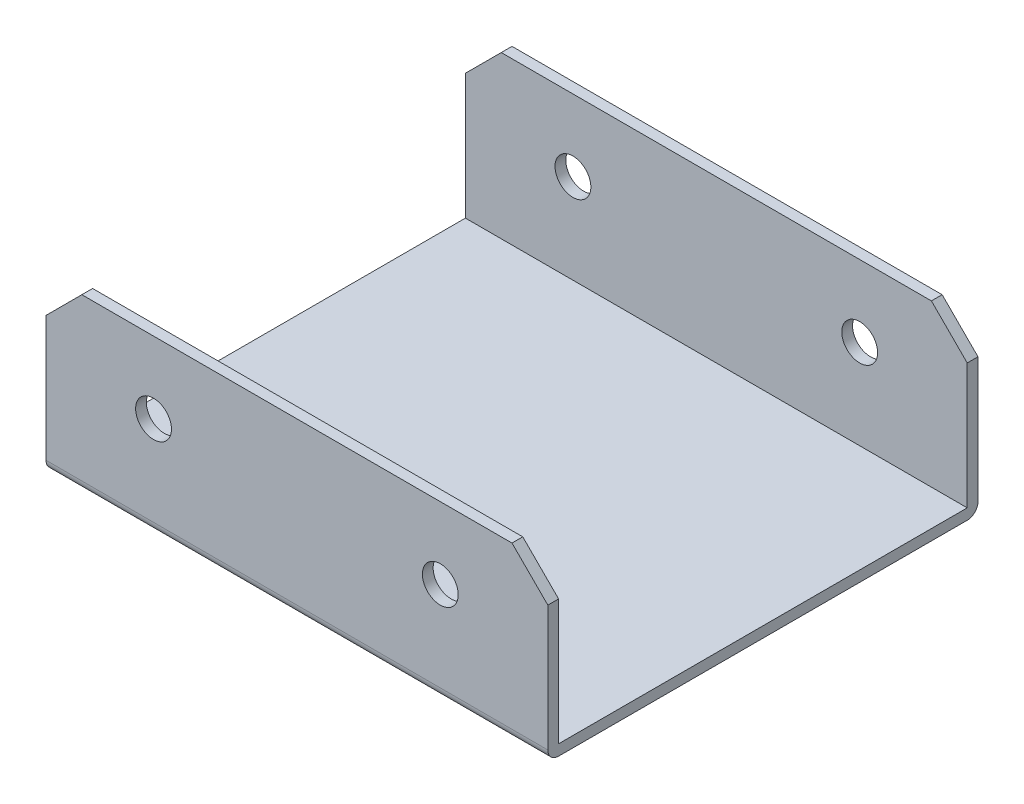
ISO-10303-21;
HEADER;
FILE_DESCRIPTION(('STEP AP214'),'2;1');
FILE_NAME('part.step','',(''),(''),'','','');
FILE_SCHEMA(('AUTOMOTIVE_DESIGN { 1 0 10303 214 1 1 1 1 }'));
ENDSEC;
DATA;
#1=APPLICATION_CONTEXT('core data for automotive mechanical design processes');
#2=APPLICATION_PROTOCOL_DEFINITION('international standard','automotive_design',2000,#1);
#3=PRODUCT_CONTEXT('',#1,'mechanical');
#4=PRODUCT('Part','Part','',(#3));
#5=PRODUCT_RELATED_PRODUCT_CATEGORY('part','',(#4));
#6=PRODUCT_DEFINITION_FORMATION('','',#4);
#7=PRODUCT_DEFINITION_CONTEXT('part definition',#1,'design');
#8=PRODUCT_DEFINITION('design','',#6,#7);
#9=PRODUCT_DEFINITION_SHAPE('','',#8);
#10=(LENGTH_UNIT() NAMED_UNIT(*) SI_UNIT(.MILLI.,.METRE.));
#11=(NAMED_UNIT(*) PLANE_ANGLE_UNIT() SI_UNIT($,.RADIAN.));
#12=(NAMED_UNIT(*) SI_UNIT($,.STERADIAN.) SOLID_ANGLE_UNIT());
#13=UNCERTAINTY_MEASURE_WITH_UNIT(LENGTH_MEASURE(1.E-05),#10,'distance_accuracy_value','');
#14=(GEOMETRIC_REPRESENTATION_CONTEXT(3) GLOBAL_UNCERTAINTY_ASSIGNED_CONTEXT((#13)) GLOBAL_UNIT_ASSIGNED_CONTEXT((#10,
#11,#12)) REPRESENTATION_CONTEXT('',''));
#15=CARTESIAN_POINT('',(0.,0.,0.));
#16=DIRECTION('',(0.,0.,1.));
#17=DIRECTION('',(1.,0.,0.));
#18=AXIS2_PLACEMENT_3D('',#15,#16,#17);
#19=CARTESIAN_POINT('',(-20.,14.,30.));
#20=DIRECTION('',(0.,0.,-1.));
#21=DIRECTION('',(0.,-1.,0.));
#22=AXIS2_PLACEMENT_3D('',#19,#20,#21);
#23=CYLINDRICAL_SURFACE('',#22,2.5);
#24=CARTESIAN_POINT('',(-20.,14.,30.));
#25=DIRECTION('',(0.,0.,-1.));
#26=DIRECTION('',(0.,-1.,0.));
#27=AXIS2_PLACEMENT_3D('',#24,#25,#26);
#28=CIRCLE('',#27,2.5);
#29=CARTESIAN_POINT('',(-20.,11.5,30.));
#30=VERTEX_POINT('',#29);
#31=EDGE_CURVE('E155',#30,#30,#28,.T.);
#32=ORIENTED_EDGE('',*,*,#31,.F.);
#33=EDGE_LOOP('',(#32));
#34=FACE_BOUND('',#33,.T.);
#35=CARTESIAN_POINT('',(-20.,14.,28.5));
#36=DIRECTION('',(0.,0.,1.));
#37=DIRECTION('',(1.,0.,0.));
#38=AXIS2_PLACEMENT_3D('',#35,#36,#37);
#39=CIRCLE('',#38,2.5);
#40=CARTESIAN_POINT('',(-17.5,14.,28.5));
#41=VERTEX_POINT('',#40);
#42=EDGE_CURVE('E165',#41,#41,#39,.T.);
#43=ORIENTED_EDGE('',*,*,#42,.F.);
#44=EDGE_LOOP('',(#43));
#45=FACE_BOUND('',#44,.T.);
#46=ADVANCED_FACE('F16',(#34,#45),#23,.F.);
#47=CARTESIAN_POINT('',(-20.,14.,30.));
#48=DIRECTION('',(0.,0.,-1.));
#49=DIRECTION('',(0.,-1.,0.));
#50=AXIS2_PLACEMENT_3D('',#47,#48,#49);
#51=CYLINDRICAL_SURFACE('',#50,2.5);
#52=CARTESIAN_POINT('',(-20.,14.,-28.5));
#53=DIRECTION('',(0.,0.,-1.));
#54=DIRECTION('',(0.,-1.,0.));
#55=AXIS2_PLACEMENT_3D('',#52,#53,#54);
#56=CIRCLE('',#55,2.5);
#57=CARTESIAN_POINT('',(-20.,11.5,-28.5));
#58=VERTEX_POINT('',#57);
#59=EDGE_CURVE('E192',#58,#58,#56,.T.);
#60=ORIENTED_EDGE('',*,*,#59,.F.);
#61=EDGE_LOOP('',(#60));
#62=FACE_BOUND('',#61,.T.);
#63=CARTESIAN_POINT('',(-20.,14.,-30.));
#64=DIRECTION('',(0.,0.,1.));
#65=DIRECTION('',(1.,0.,0.));
#66=AXIS2_PLACEMENT_3D('',#63,#64,#65);
#67=CIRCLE('',#66,2.5);
#68=CARTESIAN_POINT('',(-17.5,14.,-30.));
#69=VERTEX_POINT('',#68);
#70=EDGE_CURVE('E214',#69,#69,#67,.T.);
#71=ORIENTED_EDGE('',*,*,#70,.F.);
#72=EDGE_LOOP('',(#71));
#73=FACE_BOUND('',#72,.T.);
#74=ADVANCED_FACE('F269',(#62,#73),#51,.F.);
#75=CARTESIAN_POINT('',(20.,14.,30.));
#76=DIRECTION('',(0.,0.,-1.));
#77=DIRECTION('',(0.,-1.,0.));
#78=AXIS2_PLACEMENT_3D('',#75,#76,#77);
#79=CYLINDRICAL_SURFACE('',#78,2.5);
#80=CARTESIAN_POINT('',(20.,14.,30.));
#81=DIRECTION('',(0.,0.,-1.));
#82=DIRECTION('',(0.,-1.,0.));
#83=AXIS2_PLACEMENT_3D('',#80,#81,#82);
#84=CIRCLE('',#83,2.5);
#85=CARTESIAN_POINT('',(20.,11.5,30.));
#86=VERTEX_POINT('',#85);
#87=EDGE_CURVE('E180',#86,#86,#84,.T.);
#88=ORIENTED_EDGE('',*,*,#87,.F.);
#89=EDGE_LOOP('',(#88));
#90=FACE_BOUND('',#89,.T.);
#91=CARTESIAN_POINT('',(20.,14.,28.5));
#92=DIRECTION('',(0.,0.,1.));
#93=DIRECTION('',(1.,0.,0.));
#94=AXIS2_PLACEMENT_3D('',#91,#92,#93);
#95=CIRCLE('',#94,2.5);
#96=CARTESIAN_POINT('',(22.5,14.,28.5));
#97=VERTEX_POINT('',#96);
#98=EDGE_CURVE('E162',#97,#97,#95,.T.);
#99=ORIENTED_EDGE('',*,*,#98,.F.);
#100=EDGE_LOOP('',(#99));
#101=FACE_BOUND('',#100,.T.);
#102=ADVANCED_FACE('F275',(#90,#101),#79,.F.);
#103=CARTESIAN_POINT('',(20.,14.,30.));
#104=DIRECTION('',(0.,0.,-1.));
#105=DIRECTION('',(0.,-1.,0.));
#106=AXIS2_PLACEMENT_3D('',#103,#104,#105);
#107=CYLINDRICAL_SURFACE('',#106,2.5);
#108=CARTESIAN_POINT('',(20.,14.,-28.5));
#109=DIRECTION('',(0.,0.,-1.));
#110=DIRECTION('',(0.,-1.,0.));
#111=AXIS2_PLACEMENT_3D('',#108,#109,#110);
#112=CIRCLE('',#111,2.5);
#113=CARTESIAN_POINT('',(20.,11.5,-28.5));
#114=VERTEX_POINT('',#113);
#115=EDGE_CURVE('E204',#114,#114,#112,.T.);
#116=ORIENTED_EDGE('',*,*,#115,.F.);
#117=EDGE_LOOP('',(#116));
#118=FACE_BOUND('',#117,.T.);
#119=CARTESIAN_POINT('',(20.,14.,-30.));
#120=DIRECTION('',(0.,0.,1.));
#121=DIRECTION('',(1.,0.,0.));
#122=AXIS2_PLACEMENT_3D('',#119,#120,#121);
#123=CIRCLE('',#122,2.5);
#124=CARTESIAN_POINT('',(22.5,14.,-30.));
#125=VERTEX_POINT('',#124);
#126=EDGE_CURVE('E199',#125,#125,#123,.T.);
#127=ORIENTED_EDGE('',*,*,#126,.F.);
#128=EDGE_LOOP('',(#127));
#129=FACE_BOUND('',#128,.T.);
#130=ADVANCED_FACE('F266',(#118,#129),#107,.F.);
#131=CARTESIAN_POINT('',(-32.5,21.5,28.875));
#132=DIRECTION('',(-0.707106781186548,0.707106781186548,0.));
#133=DIRECTION('',(-0.707106781186548,-0.707106781186548,0.));
#134=AXIS2_PLACEMENT_3D('',#131,#132,#133);
#135=PLANE('',#134);
#136=DIRECTION('',(0.707106781186548,0.707106781186548,0.));
#137=VECTOR('',#136,1.);
#138=CARTESIAN_POINT('',(-23.75,30.25,30.));
#139=LINE('',#138,#137);
#140=CARTESIAN_POINT('',(-35.,19.,30.));
#141=VERTEX_POINT('',#140);
#142=CARTESIAN_POINT('',(-30.,24.,30.));
#143=VERTEX_POINT('',#142);
#144=EDGE_CURVE('E10',#141,#143,#139,.T.);
#145=ORIENTED_EDGE('',*,*,#144,.T.);
#146=DIRECTION('',(0.,0.,-1.));
#147=VECTOR('',#146,1.);
#148=CARTESIAN_POINT('',(-30.,24.,28.875));
#149=LINE('',#148,#147);
#150=CARTESIAN_POINT('',(-30.,24.,28.5));
#151=VERTEX_POINT('',#150);
#152=EDGE_CURVE('E26',#143,#151,#149,.T.);
#153=ORIENTED_EDGE('',*,*,#152,.T.);
#154=DIRECTION('',(-0.707106781186548,-0.707106781186548,0.));
#155=VECTOR('',#154,1.);
#156=CARTESIAN_POINT('',(-29.375,24.625,28.5));
#157=LINE('',#156,#155);
#158=CARTESIAN_POINT('',(-35.,19.,28.5));
#159=VERTEX_POINT('',#158);
#160=EDGE_CURVE('E147',#151,#159,#157,.T.);
#161=ORIENTED_EDGE('',*,*,#160,.T.);
#162=DIRECTION('',(0.,0.,1.));
#163=VECTOR('',#162,1.);
#164=CARTESIAN_POINT('',(-35.,19.,28.875));
#165=LINE('',#164,#163);
#166=EDGE_CURVE('E142',#159,#141,#165,.T.);
#167=ORIENTED_EDGE('',*,*,#166,.T.);
#168=EDGE_LOOP('',(#145,#153,#161,#167));
#169=FACE_BOUND('',#168,.T.);
#170=ADVANCED_FACE('F150',(#169),#135,.T.);
#171=CARTESIAN_POINT('',(0.,24.,28.5));
#172=DIRECTION('',(0.,1.,0.));
#173=DIRECTION('',(0.,0.,1.));
#174=AXIS2_PLACEMENT_3D('',#171,#172,#173);
#175=PLANE('',#174);
#176=ORIENTED_EDGE('',*,*,#152,.F.);
#177=DIRECTION('',(1.,0.,0.));
#178=VECTOR('',#177,1.);
#179=CARTESIAN_POINT('',(0.,24.,30.));
#180=LINE('',#179,#178);
#181=CARTESIAN_POINT('',(30.,24.,30.));
#182=VERTEX_POINT('',#181);
#183=EDGE_CURVE('E148',#143,#182,#180,.T.);
#184=ORIENTED_EDGE('',*,*,#183,.T.);
#185=DIRECTION('',(0.,0.,1.));
#186=VECTOR('',#185,1.);
#187=CARTESIAN_POINT('',(30.,24.,28.875));
#188=LINE('',#187,#186);
#189=CARTESIAN_POINT('',(30.,24.,28.5));
#190=VERTEX_POINT('',#189);
#191=EDGE_CURVE('E156',#190,#182,#188,.T.);
#192=ORIENTED_EDGE('',*,*,#191,.F.);
#193=DIRECTION('',(1.,0.,0.));
#194=VECTOR('',#193,1.);
#195=CARTESIAN_POINT('',(0.,24.,28.5));
#196=LINE('',#195,#194);
#197=EDGE_CURVE('E160',#151,#190,#196,.T.);
#198=ORIENTED_EDGE('',*,*,#197,.F.);
#199=EDGE_LOOP('',(#176,#184,#192,#198));
#200=FACE_BOUND('',#199,.T.);
#201=ADVANCED_FACE('F255',(#200),#175,.T.);
#202=CARTESIAN_POINT('',(0.,24.,30.));
#203=DIRECTION('',(0.,0.,1.));
#204=DIRECTION('',(1.,0.,0.));
#205=AXIS2_PLACEMENT_3D('',#202,#203,#204);
#206=PLANE('',#205);
#207=ORIENTED_EDGE('',*,*,#31,.T.);
#208=EDGE_LOOP('',(#207));
#209=FACE_BOUND('',#208,.T.);
#210=ORIENTED_EDGE('',*,*,#87,.T.);
#211=EDGE_LOOP('',(#210));
#212=FACE_BOUND('',#211,.T.);
#213=ORIENTED_EDGE('',*,*,#144,.F.);
#214=DIRECTION('',(0.,1.,0.));
#215=VECTOR('',#214,1.);
#216=CARTESIAN_POINT('',(-35.,24.,30.));
#217=LINE('',#216,#215);
#218=CARTESIAN_POINT('',(-35.,1.49999999999998,30.));
#219=VERTEX_POINT('',#218);
#220=EDGE_CURVE('E144',#219,#141,#217,.T.);
#221=ORIENTED_EDGE('',*,*,#220,.F.);
#222=DIRECTION('',(-1.,0.,0.));
#223=VECTOR('',#222,1.);
#224=CARTESIAN_POINT('',(0.,1.49999999999998,30.));
#225=LINE('',#224,#223);
#226=CARTESIAN_POINT('',(35.,1.49999999999998,30.));
#227=VERTEX_POINT('',#226);
#228=EDGE_CURVE('E137',#227,#219,#225,.T.);
#229=ORIENTED_EDGE('',*,*,#228,.F.);
#230=DIRECTION('',(0.,-1.,0.));
#231=VECTOR('',#230,1.);
#232=CARTESIAN_POINT('',(35.,24.,30.));
#233=LINE('',#232,#231);
#234=CARTESIAN_POINT('',(35.,19.,30.));
#235=VERTEX_POINT('',#234);
#236=EDGE_CURVE('E169',#235,#227,#233,.T.);
#237=ORIENTED_EDGE('',*,*,#236,.F.);
#238=DIRECTION('',(0.707106781186548,-0.707106781186548,0.));
#239=VECTOR('',#238,1.);
#240=CARTESIAN_POINT('',(23.75,30.25,30.));
#241=LINE('',#240,#239);
#242=EDGE_CURVE('E173',#182,#235,#241,.T.);
#243=ORIENTED_EDGE('',*,*,#242,.F.);
#244=ORIENTED_EDGE('',*,*,#183,.F.);
#245=EDGE_LOOP('',(#213,#221,#229,#237,#243,#244));
#246=FACE_BOUND('',#245,.T.);
#247=ADVANCED_FACE('F245',(#209,#212,#246),#206,.T.);
#248=CARTESIAN_POINT('',(-32.5,21.5000000000001,-0.375000000000015));
#249=DIRECTION('',(-0.707106781186548,0.707106781186548,0.));
#250=DIRECTION('',(-0.707106781186548,-0.707106781186548,0.));
#251=AXIS2_PLACEMENT_3D('',#248,#249,#250);
#252=PLANE('',#251);
#253=DIRECTION('',(-0.707106781186548,-0.707106781186548,0.));
#254=VECTOR('',#253,1.);
#255=CARTESIAN_POINT('',(-29.375,24.625,-30.));
#256=LINE('',#255,#254);
#257=CARTESIAN_POINT('',(-30.,24.,-30.));
#258=VERTEX_POINT('',#257);
#259=CARTESIAN_POINT('',(-35.,19.,-30.));
#260=VERTEX_POINT('',#259);
#261=EDGE_CURVE('E177',#258,#260,#256,.T.);
#262=ORIENTED_EDGE('',*,*,#261,.T.);
#263=DIRECTION('',(0.,0.,1.));
#264=VECTOR('',#263,1.);
#265=CARTESIAN_POINT('',(-35.,19.0000000000001,-0.375000000000008));
#266=LINE('',#265,#264);
#267=CARTESIAN_POINT('',(-35.,19.,-28.5));
#268=VERTEX_POINT('',#267);
#269=EDGE_CURVE('E181',#260,#268,#266,.T.);
#270=ORIENTED_EDGE('',*,*,#269,.T.);
#271=DIRECTION('',(0.707106781186548,0.707106781186548,0.));
#272=VECTOR('',#271,1.);
#273=CARTESIAN_POINT('',(-23.75,30.25,-28.5));
#274=LINE('',#273,#272);
#275=CARTESIAN_POINT('',(-30.,24.,-28.5));
#276=VERTEX_POINT('',#275);
#277=EDGE_CURVE('E184',#268,#276,#274,.T.);
#278=ORIENTED_EDGE('',*,*,#277,.T.);
#279=DIRECTION('',(0.,0.,-1.));
#280=VECTOR('',#279,1.);
#281=CARTESIAN_POINT('',(-30.,24.0000000000001,-0.375000000000023));
#282=LINE('',#281,#280);
#283=EDGE_CURVE('E187',#276,#258,#282,.T.);
#284=ORIENTED_EDGE('',*,*,#283,.T.);
#285=EDGE_LOOP('',(#262,#270,#278,#284));
#286=FACE_BOUND('',#285,.T.);
#287=ADVANCED_FACE('F263',(#286),#252,.T.);
#288=CARTESIAN_POINT('',(0.,24.,-30.));
#289=DIRECTION('',(0.,1.,0.));
#290=DIRECTION('',(0.,0.,1.));
#291=AXIS2_PLACEMENT_3D('',#288,#289,#290);
#292=PLANE('',#291);
#293=ORIENTED_EDGE('',*,*,#283,.F.);
#294=DIRECTION('',(1.,0.,0.));
#295=VECTOR('',#294,1.);
#296=CARTESIAN_POINT('',(0.,24.,-28.5));
#297=LINE('',#296,#295);
#298=CARTESIAN_POINT('',(30.,24.,-28.5));
#299=VERTEX_POINT('',#298);
#300=EDGE_CURVE('E189',#276,#299,#297,.T.);
#301=ORIENTED_EDGE('',*,*,#300,.T.);
#302=DIRECTION('',(0.,0.,1.));
#303=VECTOR('',#302,1.);
#304=CARTESIAN_POINT('',(30.,24.0000000000001,-0.375000000000023));
#305=LINE('',#304,#303);
#306=CARTESIAN_POINT('',(30.,24.,-30.));
#307=VERTEX_POINT('',#306);
#308=EDGE_CURVE('E193',#307,#299,#305,.T.);
#309=ORIENTED_EDGE('',*,*,#308,.F.);
#310=DIRECTION('',(1.,0.,0.));
#311=VECTOR('',#310,1.);
#312=CARTESIAN_POINT('',(0.,24.,-30.));
#313=LINE('',#312,#311);
#314=EDGE_CURVE('E197',#258,#307,#313,.T.);
#315=ORIENTED_EDGE('',*,*,#314,.F.);
#316=EDGE_LOOP('',(#293,#301,#309,#315));
#317=FACE_BOUND('',#316,.T.);
#318=ADVANCED_FACE('F324',(#317),#292,.T.);
#319=CARTESIAN_POINT('',(0.,24.,-28.5));
#320=DIRECTION('',(0.,0.,1.));
#321=DIRECTION('',(1.,0.,0.));
#322=AXIS2_PLACEMENT_3D('',#319,#320,#321);
#323=PLANE('',#322);
#324=ORIENTED_EDGE('',*,*,#59,.T.);
#325=EDGE_LOOP('',(#324));
#326=FACE_BOUND('',#325,.T.);
#327=ORIENTED_EDGE('',*,*,#115,.T.);
#328=EDGE_LOOP('',(#327));
#329=FACE_BOUND('',#328,.T.);
#330=ORIENTED_EDGE('',*,*,#277,.F.);
#331=DIRECTION('',(0.,1.,0.));
#332=VECTOR('',#331,1.);
#333=CARTESIAN_POINT('',(-35.,24.,-28.5));
#334=LINE('',#333,#332);
#335=CARTESIAN_POINT('',(-35.,1.5,-28.5));
#336=VERTEX_POINT('',#335);
#337=EDGE_CURVE('E129',#336,#268,#334,.T.);
#338=ORIENTED_EDGE('',*,*,#337,.F.);
#339=DIRECTION('',(1.,0.,0.));
#340=VECTOR('',#339,1.);
#341=CARTESIAN_POINT('',(0.,1.5,-28.5));
#342=LINE('',#341,#340);
#343=CARTESIAN_POINT('',(35.,1.5,-28.5));
#344=VERTEX_POINT('',#343);
#345=EDGE_CURVE('E126',#336,#344,#342,.T.);
#346=ORIENTED_EDGE('',*,*,#345,.T.);
#347=DIRECTION('',(0.,-1.,0.));
#348=VECTOR('',#347,1.);
#349=CARTESIAN_POINT('',(35.,24.,-28.5));
#350=LINE('',#349,#348);
#351=CARTESIAN_POINT('',(35.,19.,-28.5));
#352=VERTEX_POINT('',#351);
#353=EDGE_CURVE('E205',#352,#344,#350,.T.);
#354=ORIENTED_EDGE('',*,*,#353,.F.);
#355=DIRECTION('',(0.707106781186548,-0.707106781186548,0.));
#356=VECTOR('',#355,1.);
#357=CARTESIAN_POINT('',(23.75,30.25,-28.5));
#358=LINE('',#357,#356);
#359=EDGE_CURVE('E196',#299,#352,#358,.T.);
#360=ORIENTED_EDGE('',*,*,#359,.F.);
#361=ORIENTED_EDGE('',*,*,#300,.F.);
#362=EDGE_LOOP('',(#330,#338,#346,#354,#360,#361));
#363=FACE_BOUND('',#362,.T.);
#364=ADVANCED_FACE('F319',(#326,#329,#363),#323,.T.);
#365=CARTESIAN_POINT('',(32.5,21.5000000000001,-0.375000000000015));
#366=DIRECTION('',(0.707106781186548,0.707106781186548,0.));
#367=DIRECTION('',(-0.707106781186548,0.707106781186548,0.));
#368=AXIS2_PLACEMENT_3D('',#365,#366,#367);
#369=PLANE('',#368);
#370=DIRECTION('',(-0.707106781186548,0.707106781186548,0.));
#371=VECTOR('',#370,1.);
#372=CARTESIAN_POINT('',(29.375,24.625,-30.));
#373=LINE('',#372,#371);
#374=CARTESIAN_POINT('',(35.,19.,-30.));
#375=VERTEX_POINT('',#374);
#376=EDGE_CURVE('E195',#375,#307,#373,.T.);
#377=ORIENTED_EDGE('',*,*,#376,.T.);
#378=ORIENTED_EDGE('',*,*,#308,.T.);
#379=ORIENTED_EDGE('',*,*,#359,.T.);
#380=DIRECTION('',(0.,0.,-1.));
#381=VECTOR('',#380,1.);
#382=CARTESIAN_POINT('',(35.,19.0000000000001,-0.375000000000008));
#383=LINE('',#382,#381);
#384=EDGE_CURVE('E210',#352,#375,#383,.T.);
#385=ORIENTED_EDGE('',*,*,#384,.T.);
#386=EDGE_LOOP('',(#377,#378,#379,#385));
#387=FACE_BOUND('',#386,.T.);
#388=ADVANCED_FACE('F323',(#387),#369,.T.);
#389=CARTESIAN_POINT('',(0.,1.50000000000001,-30.));
#390=DIRECTION('',(0.,0.,-1.));
#391=DIRECTION('',(0.,1.,0.));
#392=AXIS2_PLACEMENT_3D('',#389,#390,#391);
#393=PLANE('',#392);
#394=ORIENTED_EDGE('',*,*,#70,.T.);
#395=EDGE_LOOP('',(#394));
#396=FACE_BOUND('',#395,.T.);
#397=ORIENTED_EDGE('',*,*,#126,.T.);
#398=EDGE_LOOP('',(#397));
#399=FACE_BOUND('',#398,.T.);
#400=ORIENTED_EDGE('',*,*,#261,.F.);
#401=ORIENTED_EDGE('',*,*,#314,.T.);
#402=ORIENTED_EDGE('',*,*,#376,.F.);
#403=DIRECTION('',(0.,1.,0.));
#404=VECTOR('',#403,1.);
#405=CARTESIAN_POINT('',(35.,1.50000000000001,-30.));
#406=LINE('',#405,#404);
#407=CARTESIAN_POINT('',(35.,1.50000000000001,-30.));
#408=VERTEX_POINT('',#407);
#409=EDGE_CURVE('E175',#408,#375,#406,.T.);
#410=ORIENTED_EDGE('',*,*,#409,.F.);
#411=DIRECTION('',(-1.,0.,0.));
#412=VECTOR('',#411,1.);
#413=CARTESIAN_POINT('',(0.,1.50000000000001,-30.));
#414=LINE('',#413,#412);
#415=CARTESIAN_POINT('',(-35.,1.50000000000001,-30.));
#416=VERTEX_POINT('',#415);
#417=EDGE_CURVE('E200',#408,#416,#414,.T.);
#418=ORIENTED_EDGE('',*,*,#417,.T.);
#419=DIRECTION('',(0.,-1.,0.));
#420=VECTOR('',#419,1.);
#421=CARTESIAN_POINT('',(-35.,1.50000000000001,-30.));
#422=LINE('',#421,#420);
#423=EDGE_CURVE('E202',#260,#416,#422,.T.);
#424=ORIENTED_EDGE('',*,*,#423,.F.);
#425=EDGE_LOOP('',(#400,#401,#402,#410,#418,#424));
#426=FACE_BOUND('',#425,.T.);
#427=ADVANCED_FACE('F337',(#396,#399,#426),#393,.T.);
#428=CARTESIAN_POINT('',(35.,12.75,29.25));
#429=DIRECTION('',(1.,0.,0.));
#430=DIRECTION('',(0.,0.,-1.));
#431=AXIS2_PLACEMENT_3D('',#428,#429,#430);
#432=PLANE('',#431);
#433=ORIENTED_EDGE('',*,*,#384,.F.);
#434=ORIENTED_EDGE('',*,*,#353,.T.);
#435=DIRECTION('',(0.,0.,1.));
#436=VECTOR('',#435,1.);
#437=CARTESIAN_POINT('',(35.,1.50000000000001,-30.));
#438=LINE('',#437,#436);
#439=CARTESIAN_POINT('',(35.,1.49999999999997,28.5));
#440=VERTEX_POINT('',#439);
#441=EDGE_CURVE('E207',#344,#440,#438,.T.);
#442=ORIENTED_EDGE('',*,*,#441,.T.);
#443=DIRECTION('',(0.,1.,0.));
#444=VECTOR('',#443,1.);
#445=CARTESIAN_POINT('',(35.,1.49999999999997,28.5));
#446=LINE('',#445,#444);
#447=CARTESIAN_POINT('',(35.,19.,28.5));
#448=VERTEX_POINT('',#447);
#449=EDGE_CURVE('E135',#440,#448,#446,.T.);
#450=ORIENTED_EDGE('',*,*,#449,.T.);
#451=DIRECTION('',(0.,0.,-1.));
#452=VECTOR('',#451,1.);
#453=CARTESIAN_POINT('',(35.,19.,28.875));
#454=LINE('',#453,#452);
#455=EDGE_CURVE('E176',#235,#448,#454,.T.);
#456=ORIENTED_EDGE('',*,*,#455,.F.);
#457=ORIENTED_EDGE('',*,*,#236,.T.);
#458=CARTESIAN_POINT('',(35.,1.49999999999999,28.5));
#459=DIRECTION('',(1.,0.,0.));
#460=DIRECTION('',(0.,1.,0.));
#461=AXIS2_PLACEMENT_3D('',#458,#459,#460);
#462=CIRCLE('',#461,1.5);
#463=CARTESIAN_POINT('',(35.,0.,28.5));
#464=VERTEX_POINT('',#463);
#465=EDGE_CURVE('E172',#227,#464,#462,.T.);
#466=ORIENTED_EDGE('',*,*,#465,.T.);
#467=DIRECTION('',(0.,0.,-1.));
#468=VECTOR('',#467,1.);
#469=CARTESIAN_POINT('',(35.,0.,28.5));
#470=LINE('',#469,#468);
#471=CARTESIAN_POINT('',(35.,0.,-28.5));
#472=VERTEX_POINT('',#471);
#473=EDGE_CURVE('E227',#464,#472,#470,.T.);
#474=ORIENTED_EDGE('',*,*,#473,.T.);
#475=CARTESIAN_POINT('',(35.,1.50000000000002,-28.5));
#476=DIRECTION('',(1.,0.,0.));
#477=DIRECTION('',(0.,1.,0.));
#478=AXIS2_PLACEMENT_3D('',#475,#476,#477);
#479=CIRCLE('',#478,1.49999999999999);
#480=EDGE_CURVE('E217',#472,#408,#479,.T.);
#481=ORIENTED_EDGE('',*,*,#480,.T.);
#482=ORIENTED_EDGE('',*,*,#409,.T.);
#483=EDGE_LOOP('',(#433,#434,#442,#450,#456,#457,#466,#474,#481,#482));
#484=FACE_BOUND('',#483,.T.);
#485=ADVANCED_FACE('F250',(#484),#432,.T.);
#486=CARTESIAN_POINT('',(32.5,21.5,28.875));
#487=DIRECTION('',(0.707106781186548,0.707106781186548,0.));
#488=DIRECTION('',(-0.707106781186548,0.707106781186548,0.));
#489=AXIS2_PLACEMENT_3D('',#486,#487,#488);
#490=PLANE('',#489);
#491=ORIENTED_EDGE('',*,*,#242,.T.);
#492=ORIENTED_EDGE('',*,*,#455,.T.);
#493=DIRECTION('',(-0.707106781186548,0.707106781186548,0.));
#494=VECTOR('',#493,1.);
#495=CARTESIAN_POINT('',(29.375,24.625,28.5));
#496=LINE('',#495,#494);
#497=EDGE_CURVE('E158',#448,#190,#496,.T.);
#498=ORIENTED_EDGE('',*,*,#497,.T.);
#499=ORIENTED_EDGE('',*,*,#191,.T.);
#500=EDGE_LOOP('',(#491,#492,#498,#499));
#501=FACE_BOUND('',#500,.T.);
#502=ADVANCED_FACE('F252',(#501),#490,.T.);
#503=CARTESIAN_POINT('',(0.,1.50000000000002,-28.5));
#504=DIRECTION('',(1.,0.,0.));
#505=DIRECTION('',(0.,1.,0.));
#506=AXIS2_PLACEMENT_3D('',#503,#504,#505);
#507=CYLINDRICAL_SURFACE('',#506,1.49999999999999);
#508=ORIENTED_EDGE('',*,*,#417,.F.);
#509=ORIENTED_EDGE('',*,*,#480,.F.);
#510=DIRECTION('',(1.,0.,0.));
#511=VECTOR('',#510,1.);
#512=CARTESIAN_POINT('',(0.,0.,-28.5));
#513=LINE('',#512,#511);
#514=CARTESIAN_POINT('',(-35.,0.,-28.5));
#515=VERTEX_POINT('',#514);
#516=EDGE_CURVE('E159',#515,#472,#513,.T.);
#517=ORIENTED_EDGE('',*,*,#516,.F.);
#518=CARTESIAN_POINT('',(-35.,1.50000000000002,-28.5));
#519=DIRECTION('',(-1.,0.,0.));
#520=DIRECTION('',(0.,0.,1.));
#521=AXIS2_PLACEMENT_3D('',#518,#519,#520);
#522=CIRCLE('',#521,1.49999999999999);
#523=EDGE_CURVE('E221',#416,#515,#522,.T.);
#524=ORIENTED_EDGE('',*,*,#523,.F.);
#525=EDGE_LOOP('',(#508,#509,#517,#524));
#526=FACE_BOUND('',#525,.T.);
#527=ADVANCED_FACE('F282',(#526),#507,.T.);
#528=CARTESIAN_POINT('',(0.,0.,28.5));
#529=DIRECTION('',(0.,-1.,0.));
#530=DIRECTION('',(0.,0.,-1.));
#531=AXIS2_PLACEMENT_3D('',#528,#529,#530);
#532=PLANE('',#531);
#533=ORIENTED_EDGE('',*,*,#516,.T.);
#534=ORIENTED_EDGE('',*,*,#473,.F.);
#535=DIRECTION('',(1.,0.,0.));
#536=VECTOR('',#535,1.);
#537=CARTESIAN_POINT('',(0.,0.,28.5));
#538=LINE('',#537,#536);
#539=CARTESIAN_POINT('',(-35.,0.,28.5));
#540=VERTEX_POINT('',#539);
#541=EDGE_CURVE('E168',#540,#464,#538,.T.);
#542=ORIENTED_EDGE('',*,*,#541,.F.);
#543=DIRECTION('',(0.,0.,1.));
#544=VECTOR('',#543,1.);
#545=CARTESIAN_POINT('',(-35.,0.,28.5));
#546=LINE('',#545,#544);
#547=EDGE_CURVE('E113',#515,#540,#546,.T.);
#548=ORIENTED_EDGE('',*,*,#547,.F.);
#549=EDGE_LOOP('',(#533,#534,#542,#548));
#550=FACE_BOUND('',#549,.T.);
#551=ADVANCED_FACE('F284',(#550),#532,.T.);
#552=CARTESIAN_POINT('',(0.,1.49999999999999,28.5));
#553=DIRECTION('',(1.,0.,0.));
#554=DIRECTION('',(0.,1.,0.));
#555=AXIS2_PLACEMENT_3D('',#552,#553,#554);
#556=CYLINDRICAL_SURFACE('',#555,1.5);
#557=ORIENTED_EDGE('',*,*,#541,.T.);
#558=ORIENTED_EDGE('',*,*,#465,.F.);
#559=ORIENTED_EDGE('',*,*,#228,.T.);
#560=CARTESIAN_POINT('',(-35.,1.49999999999999,28.5));
#561=DIRECTION('',(-1.,0.,0.));
#562=DIRECTION('',(0.,0.,1.));
#563=AXIS2_PLACEMENT_3D('',#560,#561,#562);
#564=CIRCLE('',#563,1.5);
#565=EDGE_CURVE('E164',#540,#219,#564,.T.);
#566=ORIENTED_EDGE('',*,*,#565,.F.);
#567=EDGE_LOOP('',(#557,#558,#559,#566));
#568=FACE_BOUND('',#567,.T.);
#569=ADVANCED_FACE('F18',(#568),#556,.T.);
#570=CARTESIAN_POINT('',(0.,1.50000000000001,-30.));
#571=DIRECTION('',(0.,1.,0.));
#572=DIRECTION('',(0.,0.,1.));
#573=AXIS2_PLACEMENT_3D('',#570,#571,#572);
#574=PLANE('',#573);
#575=DIRECTION('',(1.,0.,0.));
#576=VECTOR('',#575,1.);
#577=CARTESIAN_POINT('',(0.,1.49999999999997,28.5));
#578=LINE('',#577,#576);
#579=CARTESIAN_POINT('',(-35.,1.49999999999997,28.5));
#580=VERTEX_POINT('',#579);
#581=EDGE_CURVE('E124',#580,#440,#578,.T.);
#582=ORIENTED_EDGE('',*,*,#581,.T.);
#583=ORIENTED_EDGE('',*,*,#441,.F.);
#584=ORIENTED_EDGE('',*,*,#345,.F.);
#585=DIRECTION('',(0.,0.,-1.));
#586=VECTOR('',#585,1.);
#587=CARTESIAN_POINT('',(-35.,1.50000000000001,-30.));
#588=LINE('',#587,#586);
#589=EDGE_CURVE('E120',#580,#336,#588,.T.);
#590=ORIENTED_EDGE('',*,*,#589,.F.);
#591=EDGE_LOOP('',(#582,#583,#584,#590));
#592=FACE_BOUND('',#591,.T.);
#593=ADVANCED_FACE('F122',(#592),#574,.T.);
#594=CARTESIAN_POINT('',(-35.,12.75,29.25));
#595=DIRECTION('',(-1.,0.,0.));
#596=DIRECTION('',(0.,0.,1.));
#597=AXIS2_PLACEMENT_3D('',#594,#595,#596);
#598=PLANE('',#597);
#599=ORIENTED_EDGE('',*,*,#166,.F.);
#600=DIRECTION('',(0.,-1.,0.));
#601=VECTOR('',#600,1.);
#602=CARTESIAN_POINT('',(-35.,1.49999999999997,28.5));
#603=LINE('',#602,#601);
#604=EDGE_CURVE('E20',#159,#580,#603,.T.);
#605=ORIENTED_EDGE('',*,*,#604,.T.);
#606=ORIENTED_EDGE('',*,*,#589,.T.);
#607=ORIENTED_EDGE('',*,*,#337,.T.);
#608=ORIENTED_EDGE('',*,*,#269,.F.);
#609=ORIENTED_EDGE('',*,*,#423,.T.);
#610=ORIENTED_EDGE('',*,*,#523,.T.);
#611=ORIENTED_EDGE('',*,*,#547,.T.);
#612=ORIENTED_EDGE('',*,*,#565,.T.);
#613=ORIENTED_EDGE('',*,*,#220,.T.);
#614=EDGE_LOOP('',(#599,#605,#606,#607,#608,#609,#610,#611,#612,#613));
#615=FACE_BOUND('',#614,.T.);
#616=ADVANCED_FACE('F139',(#615),#598,.T.);
#617=CARTESIAN_POINT('',(0.,1.49999999999997,28.5));
#618=DIRECTION('',(0.,0.,-1.));
#619=DIRECTION('',(0.,1.,0.));
#620=AXIS2_PLACEMENT_3D('',#617,#618,#619);
#621=PLANE('',#620);
#622=ORIENTED_EDGE('',*,*,#42,.T.);
#623=EDGE_LOOP('',(#622));
#624=FACE_BOUND('',#623,.T.);
#625=ORIENTED_EDGE('',*,*,#98,.T.);
#626=EDGE_LOOP('',(#625));
#627=FACE_BOUND('',#626,.T.);
#628=ORIENTED_EDGE('',*,*,#160,.F.);
#629=ORIENTED_EDGE('',*,*,#197,.T.);
#630=ORIENTED_EDGE('',*,*,#497,.F.);
#631=ORIENTED_EDGE('',*,*,#449,.F.);
#632=ORIENTED_EDGE('',*,*,#581,.F.);
#633=ORIENTED_EDGE('',*,*,#604,.F.);
#634=EDGE_LOOP('',(#628,#629,#630,#631,#632,#633));
#635=FACE_BOUND('',#634,.T.);
#636=ADVANCED_FACE('F132',(#624,#627,#635),#621,.T.);
#637=CLOSED_SHELL('',(#46,#74,#102,#130,#170,#201,#247,#287,#318,#364,#388,#427,#485,#502,#527,
#551,#569,#593,#616,#636));
#638=MANIFOLD_SOLID_BREP('B1',#637);
#639=ADVANCED_BREP_SHAPE_REPRESENTATION('',(#18,#638),#14);
#640=SHAPE_DEFINITION_REPRESENTATION(#9,#639);
ENDSEC;
END-ISO-10303-21;
